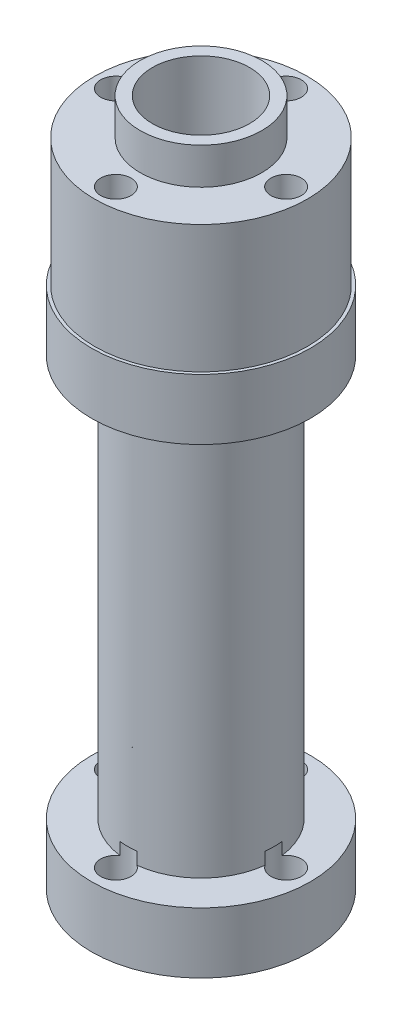
ISO-10303-21;
HEADER;
FILE_DESCRIPTION(('STEP AP214'),'2;1');
FILE_NAME('part.step','',(''),(''),'','','');
FILE_SCHEMA(('AUTOMOTIVE_DESIGN { 1 0 10303 214 1 1 1 1 }'));
ENDSEC;
DATA;
#1=APPLICATION_CONTEXT('core data for automotive mechanical design processes');
#2=APPLICATION_PROTOCOL_DEFINITION('international standard','automotive_design',2000,#1);
#3=PRODUCT_CONTEXT('',#1,'mechanical');
#4=PRODUCT('Part','Part','',(#3));
#5=PRODUCT_RELATED_PRODUCT_CATEGORY('part','',(#4));
#6=PRODUCT_DEFINITION_FORMATION('','',#4);
#7=PRODUCT_DEFINITION_CONTEXT('part definition',#1,'design');
#8=PRODUCT_DEFINITION('design','',#6,#7);
#9=PRODUCT_DEFINITION_SHAPE('','',#8);
#10=(LENGTH_UNIT() NAMED_UNIT(*) SI_UNIT(.MILLI.,.METRE.));
#11=(NAMED_UNIT(*) PLANE_ANGLE_UNIT() SI_UNIT($,.RADIAN.));
#12=(NAMED_UNIT(*) SI_UNIT($,.STERADIAN.) SOLID_ANGLE_UNIT());
#13=UNCERTAINTY_MEASURE_WITH_UNIT(LENGTH_MEASURE(1.E-05),#10,'distance_accuracy_value','');
#14=(GEOMETRIC_REPRESENTATION_CONTEXT(3) GLOBAL_UNCERTAINTY_ASSIGNED_CONTEXT((#13)) GLOBAL_UNIT_ASSIGNED_CONTEXT((#10,
#11,#12)) REPRESENTATION_CONTEXT('',''));
#15=CARTESIAN_POINT('',(0.,0.,0.));
#16=DIRECTION('',(0.,0.,1.));
#17=DIRECTION('',(1.,0.,0.));
#18=AXIS2_PLACEMENT_3D('',#15,#16,#17);
#19=CARTESIAN_POINT('',(-4.,53.5,0.));
#20=DIRECTION('',(0.,-1.,0.));
#21=DIRECTION('',(0.,0.,-1.));
#22=AXIS2_PLACEMENT_3D('',#19,#20,#21);
#23=PLANE('',#22);
#24=CARTESIAN_POINT('',(0.,53.5,0.));
#25=DIRECTION('',(0.,-1.,0.));
#26=DIRECTION('',(0.,0.,-1.));
#27=AXIS2_PLACEMENT_3D('',#24,#25,#26);
#28=CIRCLE('',#27,8.75);
#29=CARTESIAN_POINT('',(0.,53.5,-8.75));
#30=VERTEX_POINT('',#29);
#31=EDGE_CURVE('E121',#30,#30,#28,.T.);
#32=ORIENTED_EDGE('',*,*,#31,.F.);
#33=EDGE_LOOP('',(#32));
#34=FACE_BOUND('',#33,.T.);
#35=CARTESIAN_POINT('',(-7.,53.5,0.));
#36=DIRECTION('',(0.,1.,0.));
#37=DIRECTION('',(0.,0.,1.));
#38=AXIS2_PLACEMENT_3D('',#35,#36,#37);
#39=CIRCLE('',#38,1.25000000000013);
#40=CARTESIAN_POINT('',(-7.,53.5,1.25000000000013));
#41=VERTEX_POINT('',#40);
#42=EDGE_CURVE('E183',#41,#41,#39,.T.);
#43=ORIENTED_EDGE('',*,*,#42,.F.);
#44=EDGE_LOOP('',(#43));
#45=FACE_BOUND('',#44,.T.);
#46=CARTESIAN_POINT('',(0.,53.5,7.));
#47=DIRECTION('',(0.,1.,0.));
#48=DIRECTION('',(0.,0.,1.));
#49=AXIS2_PLACEMENT_3D('',#46,#47,#48);
#50=CIRCLE('',#49,1.25000000000038);
#51=CARTESIAN_POINT('',(0.,53.5,8.25000000000038));
#52=VERTEX_POINT('',#51);
#53=EDGE_CURVE('E200',#52,#52,#50,.T.);
#54=ORIENTED_EDGE('',*,*,#53,.F.);
#55=EDGE_LOOP('',(#54));
#56=FACE_BOUND('',#55,.T.);
#57=CARTESIAN_POINT('',(7.,53.5,0.));
#58=DIRECTION('',(0.,1.,0.));
#59=DIRECTION('',(0.,0.,1.));
#60=AXIS2_PLACEMENT_3D('',#57,#58,#59);
#61=CIRCLE('',#60,1.25000000000025);
#62=CARTESIAN_POINT('',(7.,53.5,1.25000000000025));
#63=VERTEX_POINT('',#62);
#64=EDGE_CURVE('E194',#63,#63,#61,.T.);
#65=ORIENTED_EDGE('',*,*,#64,.F.);
#66=EDGE_LOOP('',(#65));
#67=FACE_BOUND('',#66,.T.);
#68=CARTESIAN_POINT('',(0.,53.5,-7.));
#69=DIRECTION('',(0.,1.,0.));
#70=DIRECTION('',(0.,0.,1.));
#71=AXIS2_PLACEMENT_3D('',#68,#69,#70);
#72=CIRCLE('',#71,1.25);
#73=CARTESIAN_POINT('',(0.,53.5,-5.75));
#74=VERTEX_POINT('',#73);
#75=EDGE_CURVE('E188',#74,#74,#72,.T.);
#76=ORIENTED_EDGE('',*,*,#75,.F.);
#77=EDGE_LOOP('',(#76));
#78=FACE_BOUND('',#77,.T.);
#79=CARTESIAN_POINT('',(0.,53.5,0.));
#80=DIRECTION('',(0.,-1.,0.));
#81=DIRECTION('',(0.,0.,-1.));
#82=AXIS2_PLACEMENT_3D('',#79,#80,#81);
#83=CIRCLE('',#82,5.);
#84=CARTESIAN_POINT('',(0.,53.5,-5.));
#85=VERTEX_POINT('',#84);
#86=EDGE_CURVE('E11',#85,#85,#83,.F.);
#87=ORIENTED_EDGE('',*,*,#86,.F.);
#88=EDGE_LOOP('',(#87));
#89=FACE_BOUND('',#88,.T.);
#90=ADVANCED_FACE('F36',(#34,#45,#56,#67,#78,#89),#23,.F.);
#91=CARTESIAN_POINT('',(0.,0.,0.));
#92=DIRECTION('',(0.,-1.,0.));
#93=DIRECTION('',(0.,0.,-1.));
#94=AXIS2_PLACEMENT_3D('',#91,#92,#93);
#95=CYLINDRICAL_SURFACE('',#94,6.);
#96=CARTESIAN_POINT('',(0.,38.,0.));
#97=DIRECTION('',(0.,-1.,0.));
#98=DIRECTION('',(0.,0.,-1.));
#99=AXIS2_PLACEMENT_3D('',#96,#97,#98);
#100=CIRCLE('',#99,6.);
#101=CARTESIAN_POINT('',(0.,38.,-6.));
#102=VERTEX_POINT('',#101);
#103=EDGE_CURVE('E220',#102,#102,#100,.T.);
#104=ORIENTED_EDGE('',*,*,#103,.T.);
#105=EDGE_LOOP('',(#104));
#106=FACE_BOUND('',#105,.T.);
#107=DIRECTION('',(0.,-1.,0.));
#108=VECTOR('',#107,1.);
#109=CARTESIAN_POINT('',(0.693201658639686,3.,-5.95982142857143));
#110=LINE('',#109,#108);
#111=CARTESIAN_POINT('',(0.693201658639688,6.,-5.95982142857143));
#112=VERTEX_POINT('',#111);
#113=CARTESIAN_POINT('',(0.69320165863969,5.,-5.95982142857143));
#114=VERTEX_POINT('',#113);
#115=EDGE_CURVE('E137',#112,#114,#110,.T.);
#116=ORIENTED_EDGE('',*,*,#115,.F.);
#117=CARTESIAN_POINT('',(0.,6.,0.));
#118=DIRECTION('',(0.,1.,0.));
#119=DIRECTION('',(0.,0.,1.));
#120=AXIS2_PLACEMENT_3D('',#117,#118,#119);
#121=CIRCLE('',#120,6.);
#122=CARTESIAN_POINT('',(-0.693201658639688,6.,-5.95982142857143));
#123=VERTEX_POINT('',#122);
#124=EDGE_CURVE('E44',#112,#123,#121,.T.);
#125=ORIENTED_EDGE('',*,*,#124,.T.);
#126=DIRECTION('',(0.,-1.,0.));
#127=VECTOR('',#126,1.);
#128=CARTESIAN_POINT('',(-0.693201658639686,3.,-5.95982142857143));
#129=LINE('',#128,#127);
#130=CARTESIAN_POINT('',(-0.69320165863969,5.,-5.95982142857143));
#131=VERTEX_POINT('',#130);
#132=EDGE_CURVE('E134',#131,#123,#129,.F.);
#133=ORIENTED_EDGE('',*,*,#132,.F.);
#134=CARTESIAN_POINT('',(0.,5.,0.));
#135=DIRECTION('',(0.,-1.,0.));
#136=DIRECTION('',(0.,0.,-1.));
#137=AXIS2_PLACEMENT_3D('',#134,#135,#136);
#138=CIRCLE('',#137,6.);
#139=CARTESIAN_POINT('',(-5.9598214285714,5.,-0.69320165863989));
#140=VERTEX_POINT('',#139);
#141=EDGE_CURVE('E216',#140,#131,#138,.T.);
#142=ORIENTED_EDGE('',*,*,#141,.F.);
#143=DIRECTION('',(0.,-1.,0.));
#144=VECTOR('',#143,1.);
#145=CARTESIAN_POINT('',(-5.9598214285714,3.,-0.693201658639883));
#146=LINE('',#145,#144);
#147=CARTESIAN_POINT('',(-5.9598214285714,6.,-0.693201658639888));
#148=VERTEX_POINT('',#147);
#149=EDGE_CURVE('E51',#148,#140,#146,.T.);
#150=ORIENTED_EDGE('',*,*,#149,.F.);
#151=CARTESIAN_POINT('',(0.,6.,0.));
#152=DIRECTION('',(0.,1.,0.));
#153=DIRECTION('',(0.,0.,1.));
#154=AXIS2_PLACEMENT_3D('',#151,#152,#153);
#155=CIRCLE('',#154,6.);
#156=CARTESIAN_POINT('',(-5.9598214285714,6.,0.693201658639888));
#157=VERTEX_POINT('',#156);
#158=EDGE_CURVE('E113',#148,#157,#155,.T.);
#159=ORIENTED_EDGE('',*,*,#158,.T.);
#160=DIRECTION('',(0.,-1.,0.));
#161=VECTOR('',#160,1.);
#162=CARTESIAN_POINT('',(-5.9598214285714,3.,0.693201658639883));
#163=LINE('',#162,#161);
#164=CARTESIAN_POINT('',(-5.9598214285714,5.,0.69320165863989));
#165=VERTEX_POINT('',#164);
#166=EDGE_CURVE('E101',#165,#157,#163,.F.);
#167=ORIENTED_EDGE('',*,*,#166,.F.);
#168=CARTESIAN_POINT('',(-0.69320165864025,5.,5.95982142857136));
#169=VERTEX_POINT('',#168);
#170=EDGE_CURVE('E560',#169,#165,#138,.T.);
#171=ORIENTED_EDGE('',*,*,#170,.F.);
#172=DIRECTION('',(0.,-1.,0.));
#173=VECTOR('',#172,1.);
#174=CARTESIAN_POINT('',(-0.69320165864026,3.,5.95982142857136));
#175=LINE('',#174,#173);
#176=CARTESIAN_POINT('',(-0.693201658640261,6.,5.95982142857136));
#177=VERTEX_POINT('',#176);
#178=EDGE_CURVE('E59',#177,#169,#175,.T.);
#179=ORIENTED_EDGE('',*,*,#178,.F.);
#180=CARTESIAN_POINT('',(0.,6.,0.));
#181=DIRECTION('',(0.,1.,0.));
#182=DIRECTION('',(0.,0.,1.));
#183=AXIS2_PLACEMENT_3D('',#180,#181,#182);
#184=CIRCLE('',#183,6.);
#185=CARTESIAN_POINT('',(0.693201658640266,6.,5.95982142857136));
#186=VERTEX_POINT('',#185);
#187=EDGE_CURVE('E120',#177,#186,#184,.T.);
#188=ORIENTED_EDGE('',*,*,#187,.T.);
#189=DIRECTION('',(0.,-1.,0.));
#190=VECTOR('',#189,1.);
#191=CARTESIAN_POINT('',(0.693201658640265,3.,5.95982142857136));
#192=LINE('',#191,#190);
#193=CARTESIAN_POINT('',(0.693201658640254,5.,5.95982142857136));
#194=VERTEX_POINT('',#193);
#195=EDGE_CURVE('E170',#194,#186,#192,.F.);
#196=ORIENTED_EDGE('',*,*,#195,.F.);
#197=CARTESIAN_POINT('',(5.95982142857138,5.,0.693201658640064));
#198=VERTEX_POINT('',#197);
#199=EDGE_CURVE('E221',#198,#194,#138,.T.);
#200=ORIENTED_EDGE('',*,*,#199,.F.);
#201=DIRECTION('',(0.,-1.,0.));
#202=VECTOR('',#201,1.);
#203=CARTESIAN_POINT('',(5.95982142857138,3.,0.693201658640064));
#204=LINE('',#203,#202);
#205=CARTESIAN_POINT('',(5.95982142857138,6.,0.693201658640066));
#206=VERTEX_POINT('',#205);
#207=EDGE_CURVE('E177',#206,#198,#204,.T.);
#208=ORIENTED_EDGE('',*,*,#207,.F.);
#209=CARTESIAN_POINT('',(0.,6.,0.));
#210=DIRECTION('',(0.,1.,0.));
#211=DIRECTION('',(0.,0.,1.));
#212=AXIS2_PLACEMENT_3D('',#209,#210,#211);
#213=CIRCLE('',#212,6.);
#214=CARTESIAN_POINT('',(5.95982142857138,6.,-0.693201658640061));
#215=VERTEX_POINT('',#214);
#216=EDGE_CURVE('E124',#206,#215,#213,.T.);
#217=ORIENTED_EDGE('',*,*,#216,.T.);
#218=DIRECTION('',(0.,-1.,0.));
#219=VECTOR('',#218,1.);
#220=CARTESIAN_POINT('',(5.95982142857138,3.,-0.69320165864006));
#221=LINE('',#220,#219);
#222=CARTESIAN_POINT('',(5.95982142857138,5.,-0.693201658640059));
#223=VERTEX_POINT('',#222);
#224=EDGE_CURVE('E175',#223,#215,#221,.F.);
#225=ORIENTED_EDGE('',*,*,#224,.F.);
#226=EDGE_CURVE('E217',#114,#223,#138,.T.);
#227=ORIENTED_EDGE('',*,*,#226,.F.);
#228=EDGE_LOOP('',(#116,#125,#133,#142,#150,#159,#167,#171,#179,#188,#196,#200,#208,#217,#225,#227));
#229=FACE_BOUND('',#228,.T.);
#230=ADVANCED_FACE('F118',(#106,#229),#95,.T.);
#231=CARTESIAN_POINT('',(0.,0.,0.));
#232=DIRECTION('',(0.,-1.,0.));
#233=DIRECTION('',(0.,0.,-1.));
#234=AXIS2_PLACEMENT_3D('',#231,#232,#233);
#235=CYLINDRICAL_SURFACE('',#234,4.);
#236=CARTESIAN_POINT('',(0.,0.,0.));
#237=DIRECTION('',(0.,-1.,0.));
#238=DIRECTION('',(0.,0.,-1.));
#239=AXIS2_PLACEMENT_3D('',#236,#237,#238);
#240=CIRCLE('',#239,4.);
#241=CARTESIAN_POINT('',(0.,0.,-4.));
#242=VERTEX_POINT('',#241);
#243=EDGE_CURVE('E187',#242,#242,#240,.T.);
#244=ORIENTED_EDGE('',*,*,#243,.T.);
#245=EDGE_LOOP('',(#244));
#246=FACE_BOUND('',#245,.T.);
#247=CARTESIAN_POINT('',(0.,56.5,0.));
#248=DIRECTION('',(0.,1.,0.));
#249=DIRECTION('',(0.,0.,1.));
#250=AXIS2_PLACEMENT_3D('',#247,#248,#249);
#251=CIRCLE('',#250,4.);
#252=CARTESIAN_POINT('',(0.,56.5,4.));
#253=VERTEX_POINT('',#252);
#254=EDGE_CURVE('E540',#253,#253,#251,.T.);
#255=ORIENTED_EDGE('',*,*,#254,.T.);
#256=EDGE_LOOP('',(#255));
#257=FACE_BOUND('',#256,.T.);
#258=ADVANCED_FACE('F38',(#246,#257),#235,.F.);
#259=CARTESIAN_POINT('',(0.,0.,0.));
#260=DIRECTION('',(0.,-1.,0.));
#261=DIRECTION('',(0.,0.,-1.));
#262=AXIS2_PLACEMENT_3D('',#259,#260,#261);
#263=CYLINDRICAL_SURFACE('',#262,8.75);
#264=CARTESIAN_POINT('',(0.,43.,0.));
#265=DIRECTION('',(0.,-1.,0.));
#266=DIRECTION('',(0.,0.,-1.));
#267=AXIS2_PLACEMENT_3D('',#264,#265,#266);
#268=CIRCLE('',#267,8.75);
#269=CARTESIAN_POINT('',(0.,43.,-8.75));
#270=VERTEX_POINT('',#269);
#271=EDGE_CURVE('E127',#270,#270,#268,.T.);
#272=ORIENTED_EDGE('',*,*,#271,.F.);
#273=EDGE_LOOP('',(#272));
#274=FACE_BOUND('',#273,.T.);
#275=ORIENTED_EDGE('',*,*,#31,.T.);
#276=EDGE_LOOP('',(#275));
#277=FACE_BOUND('',#276,.T.);
#278=ADVANCED_FACE('F234',(#274,#277),#263,.T.);
#279=CARTESIAN_POINT('',(-9.,43.,0.));
#280=DIRECTION('',(0.,-1.,0.));
#281=DIRECTION('',(0.,0.,-1.));
#282=AXIS2_PLACEMENT_3D('',#279,#280,#281);
#283=PLANE('',#282);
#284=CARTESIAN_POINT('',(0.,43.,0.));
#285=DIRECTION('',(0.,-1.,0.));
#286=DIRECTION('',(0.,0.,-1.));
#287=AXIS2_PLACEMENT_3D('',#284,#285,#286);
#288=CIRCLE('',#287,9.);
#289=CARTESIAN_POINT('',(0.,43.,-9.));
#290=VERTEX_POINT('',#289);
#291=EDGE_CURVE('E227',#290,#290,#288,.T.);
#292=ORIENTED_EDGE('',*,*,#291,.F.);
#293=EDGE_LOOP('',(#292));
#294=FACE_BOUND('',#293,.T.);
#295=ORIENTED_EDGE('',*,*,#271,.T.);
#296=EDGE_LOOP('',(#295));
#297=FACE_BOUND('',#296,.T.);
#298=ADVANCED_FACE('F232',(#294,#297),#283,.F.);
#299=CARTESIAN_POINT('',(0.,0.,0.));
#300=DIRECTION('',(0.,-1.,0.));
#301=DIRECTION('',(0.,0.,-1.));
#302=AXIS2_PLACEMENT_3D('',#299,#300,#301);
#303=CYLINDRICAL_SURFACE('',#302,9.);
#304=CARTESIAN_POINT('',(0.,38.,0.));
#305=DIRECTION('',(0.,-1.,0.));
#306=DIRECTION('',(0.,0.,-1.));
#307=AXIS2_PLACEMENT_3D('',#304,#305,#306);
#308=CIRCLE('',#307,9.);
#309=CARTESIAN_POINT('',(0.,38.,-9.));
#310=VERTEX_POINT('',#309);
#311=EDGE_CURVE('E224',#310,#310,#308,.T.);
#312=ORIENTED_EDGE('',*,*,#311,.F.);
#313=EDGE_LOOP('',(#312));
#314=FACE_BOUND('',#313,.T.);
#315=ORIENTED_EDGE('',*,*,#291,.T.);
#316=EDGE_LOOP('',(#315));
#317=FACE_BOUND('',#316,.T.);
#318=ADVANCED_FACE('F340',(#314,#317),#303,.T.);
#319=CARTESIAN_POINT('',(-9.,38.,0.));
#320=DIRECTION('',(0.,1.,0.));
#321=DIRECTION('',(0.,0.,1.));
#322=AXIS2_PLACEMENT_3D('',#319,#320,#321);
#323=PLANE('',#322);
#324=ORIENTED_EDGE('',*,*,#103,.F.);
#325=EDGE_LOOP('',(#324));
#326=FACE_BOUND('',#325,.T.);
#327=ORIENTED_EDGE('',*,*,#311,.T.);
#328=EDGE_LOOP('',(#327));
#329=FACE_BOUND('',#328,.T.);
#330=ADVANCED_FACE('F333',(#326,#329),#323,.F.);
#331=CARTESIAN_POINT('',(-6.,5.,0.));
#332=DIRECTION('',(0.,-1.,0.));
#333=DIRECTION('',(0.,0.,-1.));
#334=AXIS2_PLACEMENT_3D('',#331,#332,#333);
#335=PLANE('',#334);
#336=CARTESIAN_POINT('',(0.,5.,-7.));
#337=DIRECTION('',(0.,-1.,0.));
#338=DIRECTION('',(0.,0.,-1.));
#339=AXIS2_PLACEMENT_3D('',#336,#337,#338);
#340=CIRCLE('',#339,1.25);
#341=EDGE_CURVE('E179',#114,#131,#340,.F.);
#342=ORIENTED_EDGE('',*,*,#341,.F.);
#343=ORIENTED_EDGE('',*,*,#226,.T.);
#344=CARTESIAN_POINT('',(7.,5.,0.));
#345=DIRECTION('',(0.,-1.,0.));
#346=DIRECTION('',(0.,0.,-1.));
#347=AXIS2_PLACEMENT_3D('',#344,#345,#346);
#348=CIRCLE('',#347,1.25000000000025);
#349=EDGE_CURVE('E173',#198,#223,#348,.F.);
#350=ORIENTED_EDGE('',*,*,#349,.F.);
#351=ORIENTED_EDGE('',*,*,#199,.T.);
#352=CARTESIAN_POINT('',(0.,5.,7.));
#353=DIRECTION('',(0.,-1.,0.));
#354=DIRECTION('',(0.,0.,-1.));
#355=AXIS2_PLACEMENT_3D('',#352,#353,#354);
#356=CIRCLE('',#355,1.25000000000038);
#357=EDGE_CURVE('E168',#169,#194,#356,.F.);
#358=ORIENTED_EDGE('',*,*,#357,.F.);
#359=ORIENTED_EDGE('',*,*,#170,.T.);
#360=CARTESIAN_POINT('',(-7.,5.,0.));
#361=DIRECTION('',(0.,-1.,0.));
#362=DIRECTION('',(0.,0.,-1.));
#363=AXIS2_PLACEMENT_3D('',#360,#361,#362);
#364=CIRCLE('',#363,1.25000000000013);
#365=EDGE_CURVE('E105',#140,#165,#364,.F.);
#366=ORIENTED_EDGE('',*,*,#365,.F.);
#367=ORIENTED_EDGE('',*,*,#141,.T.);
#368=EDGE_LOOP('',(#342,#343,#350,#351,#358,#359,#366,#367));
#369=FACE_BOUND('',#368,.T.);
#370=CARTESIAN_POINT('',(0.,5.,0.));
#371=DIRECTION('',(0.,-1.,0.));
#372=DIRECTION('',(0.,0.,-1.));
#373=AXIS2_PLACEMENT_3D('',#370,#371,#372);
#374=CIRCLE('',#373,9.);
#375=CARTESIAN_POINT('',(0.,5.,-9.));
#376=VERTEX_POINT('',#375);
#377=EDGE_CURVE('E213',#376,#376,#374,.T.);
#378=ORIENTED_EDGE('',*,*,#377,.F.);
#379=EDGE_LOOP('',(#378));
#380=FACE_BOUND('',#379,.T.);
#381=ADVANCED_FACE('F329',(#369,#380),#335,.F.);
#382=CARTESIAN_POINT('',(0.,0.,0.));
#383=DIRECTION('',(0.,-1.,0.));
#384=DIRECTION('',(0.,0.,-1.));
#385=AXIS2_PLACEMENT_3D('',#382,#383,#384);
#386=CYLINDRICAL_SURFACE('',#385,9.);
#387=CARTESIAN_POINT('',(0.,0.,0.));
#388=DIRECTION('',(0.,-1.,0.));
#389=DIRECTION('',(0.,0.,-1.));
#390=AXIS2_PLACEMENT_3D('',#387,#388,#389);
#391=CIRCLE('',#390,9.);
#392=CARTESIAN_POINT('',(0.,0.,-9.));
#393=VERTEX_POINT('',#392);
#394=EDGE_CURVE('E210',#393,#393,#391,.T.);
#395=ORIENTED_EDGE('',*,*,#394,.F.);
#396=EDGE_LOOP('',(#395));
#397=FACE_BOUND('',#396,.T.);
#398=ORIENTED_EDGE('',*,*,#377,.T.);
#399=EDGE_LOOP('',(#398));
#400=FACE_BOUND('',#399,.T.);
#401=ADVANCED_FACE('F325',(#397,#400),#386,.T.);
#402=CARTESIAN_POINT('',(-4.,0.,0.));
#403=DIRECTION('',(0.,1.,0.));
#404=DIRECTION('',(0.,0.,1.));
#405=AXIS2_PLACEMENT_3D('',#402,#403,#404);
#406=PLANE('',#405);
#407=CARTESIAN_POINT('',(0.,0.,-7.));
#408=DIRECTION('',(0.,1.,0.));
#409=DIRECTION('',(0.,0.,1.));
#410=AXIS2_PLACEMENT_3D('',#407,#408,#409);
#411=CIRCLE('',#410,1.25);
#412=CARTESIAN_POINT('',(0.,0.,-5.75));
#413=VERTEX_POINT('',#412);
#414=EDGE_CURVE('E146',#413,#413,#411,.T.);
#415=ORIENTED_EDGE('',*,*,#414,.T.);
#416=EDGE_LOOP('',(#415));
#417=FACE_BOUND('',#416,.T.);
#418=CARTESIAN_POINT('',(7.,0.,0.));
#419=DIRECTION('',(0.,1.,0.));
#420=DIRECTION('',(0.,0.,1.));
#421=AXIS2_PLACEMENT_3D('',#418,#419,#420);
#422=CIRCLE('',#421,1.25000000000025);
#423=CARTESIAN_POINT('',(7.,0.,1.25000000000025));
#424=VERTEX_POINT('',#423);
#425=EDGE_CURVE('E158',#424,#424,#422,.T.);
#426=ORIENTED_EDGE('',*,*,#425,.T.);
#427=EDGE_LOOP('',(#426));
#428=FACE_BOUND('',#427,.T.);
#429=CARTESIAN_POINT('',(0.,0.,7.));
#430=DIRECTION('',(0.,1.,0.));
#431=DIRECTION('',(0.,0.,1.));
#432=AXIS2_PLACEMENT_3D('',#429,#430,#431);
#433=CIRCLE('',#432,1.25000000000038);
#434=CARTESIAN_POINT('',(0.,0.,8.25000000000038));
#435=VERTEX_POINT('',#434);
#436=EDGE_CURVE('E114',#435,#435,#433,.T.);
#437=ORIENTED_EDGE('',*,*,#436,.T.);
#438=EDGE_LOOP('',(#437));
#439=FACE_BOUND('',#438,.T.);
#440=CARTESIAN_POINT('',(-7.,0.,0.));
#441=DIRECTION('',(0.,1.,0.));
#442=DIRECTION('',(0.,0.,1.));
#443=AXIS2_PLACEMENT_3D('',#440,#441,#442);
#444=CIRCLE('',#443,1.25000000000013);
#445=CARTESIAN_POINT('',(-7.,0.,1.25000000000013));
#446=VERTEX_POINT('',#445);
#447=EDGE_CURVE('E115',#446,#446,#444,.T.);
#448=ORIENTED_EDGE('',*,*,#447,.T.);
#449=EDGE_LOOP('',(#448));
#450=FACE_BOUND('',#449,.T.);
#451=ORIENTED_EDGE('',*,*,#243,.F.);
#452=EDGE_LOOP('',(#451));
#453=FACE_BOUND('',#452,.T.);
#454=ORIENTED_EDGE('',*,*,#394,.T.);
#455=EDGE_LOOP('',(#454));
#456=FACE_BOUND('',#455,.T.);
#457=ADVANCED_FACE('F321',(#417,#428,#439,#450,#453,#456),#406,.F.);
#458=CARTESIAN_POINT('',(-7.,43.5,0.));
#459=DIRECTION('',(0.,1.,0.));
#460=DIRECTION('',(0.,0.,1.));
#461=AXIS2_PLACEMENT_3D('',#458,#459,#460);
#462=CYLINDRICAL_SURFACE('',#461,1.25000000000013);
#463=CARTESIAN_POINT('',(-7.,43.5,0.));
#464=DIRECTION('',(0.,1.,0.));
#465=DIRECTION('',(0.,0.,1.));
#466=AXIS2_PLACEMENT_3D('',#463,#464,#465);
#467=CIRCLE('',#466,1.25000000000013);
#468=CARTESIAN_POINT('',(-7.,43.5,1.25000000000013));
#469=VERTEX_POINT('',#468);
#470=EDGE_CURVE('E203',#469,#469,#467,.T.);
#471=ORIENTED_EDGE('',*,*,#470,.F.);
#472=EDGE_LOOP('',(#471));
#473=FACE_BOUND('',#472,.T.);
#474=ORIENTED_EDGE('',*,*,#42,.T.);
#475=EDGE_LOOP('',(#474));
#476=FACE_BOUND('',#475,.T.);
#477=ADVANCED_FACE('F317',(#473,#476),#462,.F.);
#478=CARTESIAN_POINT('',(-7.,43.5,0.));
#479=DIRECTION('',(0.,1.,0.));
#480=DIRECTION('',(0.,0.,1.));
#481=AXIS2_PLACEMENT_3D('',#478,#479,#480);
#482=PLANE('',#481);
#483=ORIENTED_EDGE('',*,*,#470,.T.);
#484=EDGE_LOOP('',(#483));
#485=FACE_BOUND('',#484,.T.);
#486=ADVANCED_FACE('F313',(#485),#482,.T.);
#487=CARTESIAN_POINT('',(0.,43.5,7.));
#488=DIRECTION('',(0.,1.,0.));
#489=DIRECTION('',(0.,0.,1.));
#490=AXIS2_PLACEMENT_3D('',#487,#488,#489);
#491=CYLINDRICAL_SURFACE('',#490,1.25000000000038);
#492=CARTESIAN_POINT('',(0.,43.5,7.));
#493=DIRECTION('',(0.,1.,0.));
#494=DIRECTION('',(0.,0.,1.));
#495=AXIS2_PLACEMENT_3D('',#492,#493,#494);
#496=CIRCLE('',#495,1.25000000000038);
#497=CARTESIAN_POINT('',(0.,43.5,8.25000000000038));
#498=VERTEX_POINT('',#497);
#499=EDGE_CURVE('E197',#498,#498,#496,.T.);
#500=ORIENTED_EDGE('',*,*,#499,.F.);
#501=EDGE_LOOP('',(#500));
#502=FACE_BOUND('',#501,.T.);
#503=ORIENTED_EDGE('',*,*,#53,.T.);
#504=EDGE_LOOP('',(#503));
#505=FACE_BOUND('',#504,.T.);
#506=ADVANCED_FACE('F309',(#502,#505),#491,.F.);
#507=CARTESIAN_POINT('',(0.,43.5,7.));
#508=DIRECTION('',(0.,1.,0.));
#509=DIRECTION('',(0.,0.,1.));
#510=AXIS2_PLACEMENT_3D('',#507,#508,#509);
#511=PLANE('',#510);
#512=ORIENTED_EDGE('',*,*,#499,.T.);
#513=EDGE_LOOP('',(#512));
#514=FACE_BOUND('',#513,.T.);
#515=ADVANCED_FACE('F305',(#514),#511,.T.);
#516=CARTESIAN_POINT('',(7.,43.5,0.));
#517=DIRECTION('',(0.,1.,0.));
#518=DIRECTION('',(0.,0.,1.));
#519=AXIS2_PLACEMENT_3D('',#516,#517,#518);
#520=CYLINDRICAL_SURFACE('',#519,1.25000000000025);
#521=CARTESIAN_POINT('',(7.,43.5,0.));
#522=DIRECTION('',(0.,1.,0.));
#523=DIRECTION('',(0.,0.,1.));
#524=AXIS2_PLACEMENT_3D('',#521,#522,#523);
#525=CIRCLE('',#524,1.25000000000025);
#526=CARTESIAN_POINT('',(7.,43.5,1.25000000000025));
#527=VERTEX_POINT('',#526);
#528=EDGE_CURVE('E191',#527,#527,#525,.T.);
#529=ORIENTED_EDGE('',*,*,#528,.F.);
#530=EDGE_LOOP('',(#529));
#531=FACE_BOUND('',#530,.T.);
#532=ORIENTED_EDGE('',*,*,#64,.T.);
#533=EDGE_LOOP('',(#532));
#534=FACE_BOUND('',#533,.T.);
#535=ADVANCED_FACE('F301',(#531,#534),#520,.F.);
#536=CARTESIAN_POINT('',(7.,43.5,0.));
#537=DIRECTION('',(0.,1.,0.));
#538=DIRECTION('',(0.,0.,1.));
#539=AXIS2_PLACEMENT_3D('',#536,#537,#538);
#540=PLANE('',#539);
#541=ORIENTED_EDGE('',*,*,#528,.T.);
#542=EDGE_LOOP('',(#541));
#543=FACE_BOUND('',#542,.T.);
#544=ADVANCED_FACE('F297',(#543),#540,.T.);
#545=CARTESIAN_POINT('',(0.,43.5,-7.));
#546=DIRECTION('',(0.,1.,0.));
#547=DIRECTION('',(0.,0.,1.));
#548=AXIS2_PLACEMENT_3D('',#545,#546,#547);
#549=CYLINDRICAL_SURFACE('',#548,1.25);
#550=CARTESIAN_POINT('',(0.,43.5,-7.));
#551=DIRECTION('',(0.,1.,0.));
#552=DIRECTION('',(0.,0.,1.));
#553=AXIS2_PLACEMENT_3D('',#550,#551,#552);
#554=CIRCLE('',#553,1.25);
#555=CARTESIAN_POINT('',(0.,43.5,-5.75));
#556=VERTEX_POINT('',#555);
#557=EDGE_CURVE('E184',#556,#556,#554,.T.);
#558=ORIENTED_EDGE('',*,*,#557,.F.);
#559=EDGE_LOOP('',(#558));
#560=FACE_BOUND('',#559,.T.);
#561=ORIENTED_EDGE('',*,*,#75,.T.);
#562=EDGE_LOOP('',(#561));
#563=FACE_BOUND('',#562,.T.);
#564=ADVANCED_FACE('F293',(#560,#563),#549,.F.);
#565=CARTESIAN_POINT('',(0.,43.5,-7.));
#566=DIRECTION('',(0.,1.,0.));
#567=DIRECTION('',(0.,0.,1.));
#568=AXIS2_PLACEMENT_3D('',#565,#566,#567);
#569=PLANE('',#568);
#570=ORIENTED_EDGE('',*,*,#557,.T.);
#571=EDGE_LOOP('',(#570));
#572=FACE_BOUND('',#571,.T.);
#573=ADVANCED_FACE('F287',(#572),#569,.T.);
#574=CARTESIAN_POINT('',(-7.,6.,0.));
#575=DIRECTION('',(0.,1.,0.));
#576=DIRECTION('',(0.,0.,1.));
#577=AXIS2_PLACEMENT_3D('',#574,#575,#576);
#578=PLANE('',#577);
#579=CARTESIAN_POINT('',(-7.,6.,0.));
#580=DIRECTION('',(0.,1.,0.));
#581=DIRECTION('',(0.,0.,1.));
#582=AXIS2_PLACEMENT_3D('',#579,#580,#581);
#583=CIRCLE('',#582,1.25000000000013);
#584=EDGE_CURVE('E104',#157,#148,#583,.T.);
#585=ORIENTED_EDGE('',*,*,#584,.F.);
#586=ORIENTED_EDGE('',*,*,#158,.F.);
#587=EDGE_LOOP('',(#585,#586));
#588=FACE_BOUND('',#587,.T.);
#589=ADVANCED_FACE('F112',(#588),#578,.F.);
#590=CARTESIAN_POINT('',(-7.,6.,0.));
#591=DIRECTION('',(0.,-1.,0.));
#592=DIRECTION('',(0.,0.,-1.));
#593=AXIS2_PLACEMENT_3D('',#590,#591,#592);
#594=CYLINDRICAL_SURFACE('',#593,1.25000000000013);
#595=ORIENTED_EDGE('',*,*,#447,.F.);
#596=EDGE_LOOP('',(#595));
#597=FACE_BOUND('',#596,.T.);
#598=ORIENTED_EDGE('',*,*,#149,.T.);
#599=ORIENTED_EDGE('',*,*,#365,.T.);
#600=ORIENTED_EDGE('',*,*,#166,.T.);
#601=ORIENTED_EDGE('',*,*,#584,.T.);
#602=EDGE_LOOP('',(#598,#599,#600,#601));
#603=FACE_BOUND('',#602,.T.);
#604=ADVANCED_FACE('F103',(#597,#603),#594,.F.);
#605=CARTESIAN_POINT('',(0.,6.,7.));
#606=DIRECTION('',(0.,1.,0.));
#607=DIRECTION('',(0.,0.,1.));
#608=AXIS2_PLACEMENT_3D('',#605,#606,#607);
#609=PLANE('',#608);
#610=CARTESIAN_POINT('',(0.,6.,7.));
#611=DIRECTION('',(0.,1.,0.));
#612=DIRECTION('',(0.,0.,1.));
#613=AXIS2_PLACEMENT_3D('',#610,#611,#612);
#614=CIRCLE('',#613,1.25000000000038);
#615=EDGE_CURVE('E161',#186,#177,#614,.T.);
#616=ORIENTED_EDGE('',*,*,#615,.F.);
#617=ORIENTED_EDGE('',*,*,#187,.F.);
#618=EDGE_LOOP('',(#616,#617));
#619=FACE_BOUND('',#618,.T.);
#620=ADVANCED_FACE('F278',(#619),#609,.F.);
#621=CARTESIAN_POINT('',(0.,6.,7.));
#622=DIRECTION('',(0.,-1.,0.));
#623=DIRECTION('',(0.,0.,-1.));
#624=AXIS2_PLACEMENT_3D('',#621,#622,#623);
#625=CYLINDRICAL_SURFACE('',#624,1.25000000000038);
#626=ORIENTED_EDGE('',*,*,#436,.F.);
#627=EDGE_LOOP('',(#626));
#628=FACE_BOUND('',#627,.T.);
#629=ORIENTED_EDGE('',*,*,#178,.T.);
#630=ORIENTED_EDGE('',*,*,#357,.T.);
#631=ORIENTED_EDGE('',*,*,#195,.T.);
#632=ORIENTED_EDGE('',*,*,#615,.T.);
#633=EDGE_LOOP('',(#629,#630,#631,#632));
#634=FACE_BOUND('',#633,.T.);
#635=ADVANCED_FACE('F273',(#628,#634),#625,.F.);
#636=CARTESIAN_POINT('',(7.,6.,0.));
#637=DIRECTION('',(0.,1.,0.));
#638=DIRECTION('',(0.,0.,1.));
#639=AXIS2_PLACEMENT_3D('',#636,#637,#638);
#640=PLANE('',#639);
#641=CARTESIAN_POINT('',(7.,6.,0.));
#642=DIRECTION('',(0.,1.,0.));
#643=DIRECTION('',(0.,0.,1.));
#644=AXIS2_PLACEMENT_3D('',#641,#642,#643);
#645=CIRCLE('',#644,1.25000000000025);
#646=EDGE_CURVE('E150',#215,#206,#645,.T.);
#647=ORIENTED_EDGE('',*,*,#646,.F.);
#648=ORIENTED_EDGE('',*,*,#216,.F.);
#649=EDGE_LOOP('',(#647,#648));
#650=FACE_BOUND('',#649,.T.);
#651=ADVANCED_FACE('F270',(#650),#640,.F.);
#652=CARTESIAN_POINT('',(7.,6.,0.));
#653=DIRECTION('',(0.,-1.,0.));
#654=DIRECTION('',(0.,0.,-1.));
#655=AXIS2_PLACEMENT_3D('',#652,#653,#654);
#656=CYLINDRICAL_SURFACE('',#655,1.25000000000025);
#657=ORIENTED_EDGE('',*,*,#425,.F.);
#658=EDGE_LOOP('',(#657));
#659=FACE_BOUND('',#658,.T.);
#660=ORIENTED_EDGE('',*,*,#207,.T.);
#661=ORIENTED_EDGE('',*,*,#349,.T.);
#662=ORIENTED_EDGE('',*,*,#224,.T.);
#663=ORIENTED_EDGE('',*,*,#646,.T.);
#664=EDGE_LOOP('',(#660,#661,#662,#663));
#665=FACE_BOUND('',#664,.T.);
#666=ADVANCED_FACE('F266',(#659,#665),#656,.F.);
#667=CARTESIAN_POINT('',(0.,6.,-7.));
#668=DIRECTION('',(0.,1.,0.));
#669=DIRECTION('',(0.,0.,1.));
#670=AXIS2_PLACEMENT_3D('',#667,#668,#669);
#671=PLANE('',#670);
#672=CARTESIAN_POINT('',(0.,6.,-7.));
#673=DIRECTION('',(0.,1.,0.));
#674=DIRECTION('',(0.,0.,1.));
#675=AXIS2_PLACEMENT_3D('',#672,#673,#674);
#676=CIRCLE('',#675,1.25);
#677=EDGE_CURVE('E142',#123,#112,#676,.T.);
#678=ORIENTED_EDGE('',*,*,#677,.F.);
#679=ORIENTED_EDGE('',*,*,#124,.F.);
#680=EDGE_LOOP('',(#678,#679));
#681=FACE_BOUND('',#680,.T.);
#682=ADVANCED_FACE('F141',(#681),#671,.F.);
#683=CARTESIAN_POINT('',(0.,6.,-7.));
#684=DIRECTION('',(0.,-1.,0.));
#685=DIRECTION('',(0.,0.,-1.));
#686=AXIS2_PLACEMENT_3D('',#683,#684,#685);
#687=CYLINDRICAL_SURFACE('',#686,1.25);
#688=ORIENTED_EDGE('',*,*,#414,.F.);
#689=EDGE_LOOP('',(#688));
#690=FACE_BOUND('',#689,.T.);
#691=ORIENTED_EDGE('',*,*,#115,.T.);
#692=ORIENTED_EDGE('',*,*,#341,.T.);
#693=ORIENTED_EDGE('',*,*,#132,.T.);
#694=ORIENTED_EDGE('',*,*,#677,.T.);
#695=EDGE_LOOP('',(#691,#692,#693,#694));
#696=FACE_BOUND('',#695,.T.);
#697=ADVANCED_FACE('F144',(#690,#696),#687,.F.);
#698=CARTESIAN_POINT('',(0.,56.5,0.));
#699=DIRECTION('',(0.,1.,0.));
#700=DIRECTION('',(0.,0.,1.));
#701=AXIS2_PLACEMENT_3D('',#698,#699,#700);
#702=PLANE('',#701);
#703=CARTESIAN_POINT('',(0.,56.5,0.));
#704=DIRECTION('',(0.,1.,0.));
#705=DIRECTION('',(0.,0.,1.));
#706=AXIS2_PLACEMENT_3D('',#703,#704,#705);
#707=CIRCLE('',#706,5.);
#708=CARTESIAN_POINT('',(0.,56.5,5.));
#709=VERTEX_POINT('',#708);
#710=EDGE_CURVE('E153',#709,#709,#707,.T.);
#711=ORIENTED_EDGE('',*,*,#710,.T.);
#712=EDGE_LOOP('',(#711));
#713=FACE_BOUND('',#712,.T.);
#714=ORIENTED_EDGE('',*,*,#254,.F.);
#715=EDGE_LOOP('',(#714));
#716=FACE_BOUND('',#715,.T.);
#717=ADVANCED_FACE('F254',(#713,#716),#702,.T.);
#718=CARTESIAN_POINT('',(0.,56.5,0.));
#719=DIRECTION('',(0.,-1.,0.));
#720=DIRECTION('',(0.,0.,-1.));
#721=AXIS2_PLACEMENT_3D('',#718,#719,#720);
#722=CYLINDRICAL_SURFACE('',#721,5.);
#723=ORIENTED_EDGE('',*,*,#710,.F.);
#724=EDGE_LOOP('',(#723));
#725=FACE_BOUND('',#724,.T.);
#726=ORIENTED_EDGE('',*,*,#86,.T.);
#727=EDGE_LOOP('',(#726));
#728=FACE_BOUND('',#727,.T.);
#729=ADVANCED_FACE('F252',(#725,#728),#722,.T.);
#730=CLOSED_SHELL('',(#90,#230,#258,#278,#298,#318,#330,#381,#401,#457,#477,#486,#506,#515,#535,
#544,#564,#573,#589,#604,#620,#635,#651,#666,#682,#697,#717,#729));
#731=MANIFOLD_SOLID_BREP('B2',#730);
#732=ADVANCED_BREP_SHAPE_REPRESENTATION('',(#18,#731),#14);
#733=SHAPE_DEFINITION_REPRESENTATION(#9,#732);
ENDSEC;
END-ISO-10303-21;
